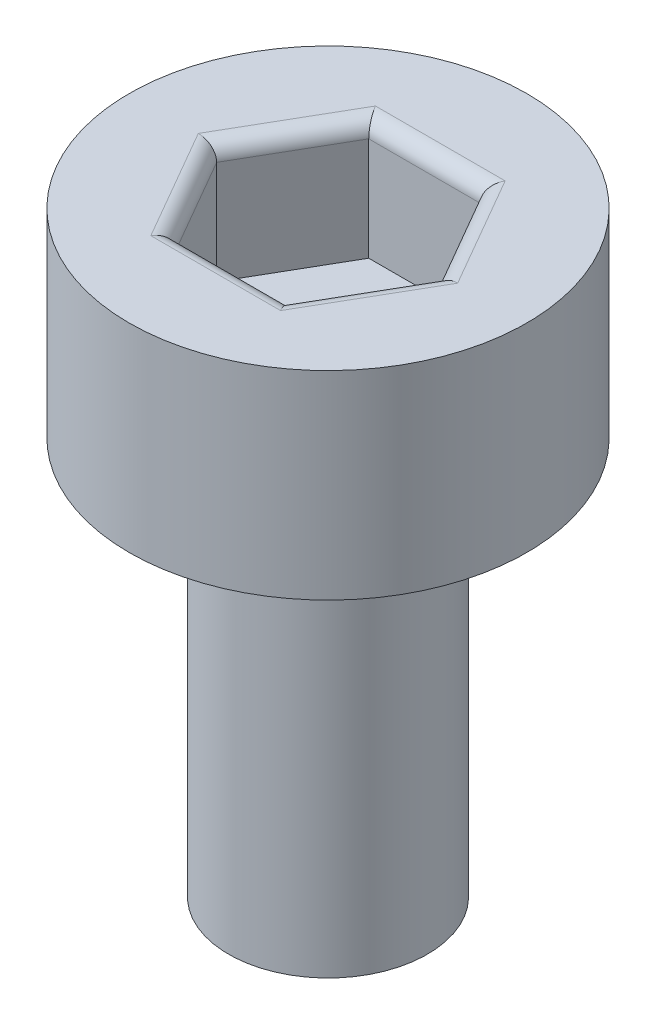
ISO-10303-21;
HEADER;
FILE_DESCRIPTION(('STEP AP214'),'2;1');
FILE_NAME('part.step','',(''),(''),'','','');
FILE_SCHEMA(('AUTOMOTIVE_DESIGN { 1 0 10303 214 1 1 1 1 }'));
ENDSEC;
DATA;
#1=APPLICATION_CONTEXT('core data for automotive mechanical design processes');
#2=APPLICATION_PROTOCOL_DEFINITION('international standard','automotive_design',2000,#1);
#3=PRODUCT_CONTEXT('',#1,'mechanical');
#4=PRODUCT('Part','Part','',(#3));
#5=PRODUCT_RELATED_PRODUCT_CATEGORY('part','',(#4));
#6=PRODUCT_DEFINITION_FORMATION('','',#4);
#7=PRODUCT_DEFINITION_CONTEXT('part definition',#1,'design');
#8=PRODUCT_DEFINITION('design','',#6,#7);
#9=PRODUCT_DEFINITION_SHAPE('','',#8);
#10=(LENGTH_UNIT() NAMED_UNIT(*) SI_UNIT(.MILLI.,.METRE.));
#11=(NAMED_UNIT(*) PLANE_ANGLE_UNIT() SI_UNIT($,.RADIAN.));
#12=(NAMED_UNIT(*) SI_UNIT($,.STERADIAN.) SOLID_ANGLE_UNIT());
#13=UNCERTAINTY_MEASURE_WITH_UNIT(LENGTH_MEASURE(1.E-05),#10,'distance_accuracy_value','');
#14=(GEOMETRIC_REPRESENTATION_CONTEXT(3) GLOBAL_UNCERTAINTY_ASSIGNED_CONTEXT((#13)) GLOBAL_UNIT_ASSIGNED_CONTEXT((#10,
#11,#12)) REPRESENTATION_CONTEXT('',''));
#15=CARTESIAN_POINT('',(0.,0.,0.));
#16=DIRECTION('',(0.,0.,1.));
#17=DIRECTION('',(1.,0.,0.));
#18=AXIS2_PLACEMENT_3D('',#15,#16,#17);
#19=CARTESIAN_POINT('',(0.,2.5,0.));
#20=DIRECTION('',(0.,1.,0.));
#21=DIRECTION('',(0.,0.,1.));
#22=AXIS2_PLACEMENT_3D('',#19,#20,#21);
#23=PLANE('',#22);
#24=DIRECTION('',(0.499999999999998,0.,-0.86602540378444));
#25=VECTOR('',#24,1.);
#26=CARTESIAN_POINT('',(-1.22320508075689,2.5,-0.706217782649105));
#27=LINE('',#26,#25);
#28=CARTESIAN_POINT('',(-1.63094010767585,2.5,0.));
#29=VERTEX_POINT('',#28);
#30=CARTESIAN_POINT('',(-0.81547005383793,2.5,-1.41243556529821));
#31=VERTEX_POINT('',#30);
#32=EDGE_CURVE('E161',#29,#31,#27,.T.);
#33=ORIENTED_EDGE('',*,*,#32,.T.);
#34=DIRECTION('',(1.,0.,0.));
#35=VECTOR('',#34,1.);
#36=CARTESIAN_POINT('',(0.,2.5,-1.41243556529821));
#37=LINE('',#36,#35);
#38=CARTESIAN_POINT('',(0.81547005383792,2.5,-1.41243556529821));
#39=VERTEX_POINT('',#38);
#40=EDGE_CURVE('E163',#31,#39,#37,.T.);
#41=ORIENTED_EDGE('',*,*,#40,.T.);
#42=DIRECTION('',(0.500000000000004,0.,0.866025403784436));
#43=VECTOR('',#42,1.);
#44=CARTESIAN_POINT('',(1.22320508075688,2.5,-0.706217782649112));
#45=LINE('',#44,#43);
#46=CARTESIAN_POINT('',(1.63094010767585,2.5,0.));
#47=VERTEX_POINT('',#46);
#48=EDGE_CURVE('E157',#39,#47,#45,.T.);
#49=ORIENTED_EDGE('',*,*,#48,.T.);
#50=DIRECTION('',(-0.499999999999998,0.,0.86602540378444));
#51=VECTOR('',#50,1.);
#52=CARTESIAN_POINT('',(1.22320508075689,2.5,0.706217782649105));
#53=LINE('',#52,#51);
#54=CARTESIAN_POINT('',(0.815470053837929,2.5,1.41243556529821));
#55=VERTEX_POINT('',#54);
#56=EDGE_CURVE('E153',#47,#55,#53,.T.);
#57=ORIENTED_EDGE('',*,*,#56,.T.);
#58=DIRECTION('',(-1.,0.,0.));
#59=VECTOR('',#58,1.);
#60=CARTESIAN_POINT('',(0.,2.5,1.41243556529821));
#61=LINE('',#60,#59);
#62=CARTESIAN_POINT('',(-0.815470053837919,2.5,1.41243556529821));
#63=VERTEX_POINT('',#62);
#64=EDGE_CURVE('E155',#55,#63,#61,.T.);
#65=ORIENTED_EDGE('',*,*,#64,.T.);
#66=DIRECTION('',(-0.500000000000004,0.,-0.866025403784436));
#67=VECTOR('',#66,1.);
#68=CARTESIAN_POINT('',(-1.22320508075688,2.5,0.706217782649112));
#69=LINE('',#68,#67);
#70=EDGE_CURVE('E159',#63,#29,#69,.T.);
#71=ORIENTED_EDGE('',*,*,#70,.T.);
#72=EDGE_LOOP('',(#33,#41,#49,#57,#65,#71));
#73=FACE_BOUND('',#72,.T.);
#74=CARTESIAN_POINT('',(0.,2.5,0.));
#75=DIRECTION('',(0.,1.,0.));
#76=DIRECTION('',(0.,0.,1.));
#77=AXIS2_PLACEMENT_3D('',#74,#75,#76);
#78=CIRCLE('',#77,2.5);
#79=CARTESIAN_POINT('',(0.,2.5,2.5));
#80=VERTEX_POINT('',#79);
#81=EDGE_CURVE('E144',#80,#80,#78,.T.);
#82=ORIENTED_EDGE('',*,*,#81,.T.);
#83=EDGE_LOOP('',(#82));
#84=FACE_BOUND('',#83,.T.);
#85=ADVANCED_FACE('F43',(#73,#84),#23,.T.);
#86=CARTESIAN_POINT('',(0.,2.5,0.));
#87=DIRECTION('',(0.,-1.,0.));
#88=DIRECTION('',(0.,0.,-1.));
#89=AXIS2_PLACEMENT_3D('',#86,#87,#88);
#90=CYLINDRICAL_SURFACE('',#89,2.5);
#91=ORIENTED_EDGE('',*,*,#81,.F.);
#92=EDGE_LOOP('',(#91));
#93=FACE_BOUND('',#92,.T.);
#94=CARTESIAN_POINT('',(0.,0.,0.));
#95=DIRECTION('',(0.,1.,0.));
#96=DIRECTION('',(0.,0.,1.));
#97=AXIS2_PLACEMENT_3D('',#94,#95,#96);
#98=CIRCLE('',#97,2.5);
#99=CARTESIAN_POINT('',(0.,0.,2.5));
#100=VERTEX_POINT('',#99);
#101=EDGE_CURVE('E140',#100,#100,#98,.T.);
#102=ORIENTED_EDGE('',*,*,#101,.T.);
#103=EDGE_LOOP('',(#102));
#104=FACE_BOUND('',#103,.T.);
#105=ADVANCED_FACE('F246',(#93,#104),#90,.T.);
#106=CARTESIAN_POINT('',(0.,0.,0.));
#107=DIRECTION('',(0.,1.,0.));
#108=DIRECTION('',(0.,0.,1.));
#109=AXIS2_PLACEMENT_3D('',#106,#107,#108);
#110=PLANE('',#109);
#111=CARTESIAN_POINT('',(0.,0.,0.));
#112=DIRECTION('',(0.,-1.,0.));
#113=DIRECTION('',(0.,0.,-1.));
#114=AXIS2_PLACEMENT_3D('',#111,#112,#113);
#115=CIRCLE('',#114,1.25);
#116=CARTESIAN_POINT('',(0.,0.,-1.25));
#117=VERTEX_POINT('',#116);
#118=EDGE_CURVE('E151',#117,#117,#115,.T.);
#119=ORIENTED_EDGE('',*,*,#118,.F.);
#120=EDGE_LOOP('',(#119));
#121=FACE_BOUND('',#120,.T.);
#122=ORIENTED_EDGE('',*,*,#101,.F.);
#123=EDGE_LOOP('',(#122));
#124=FACE_BOUND('',#123,.T.);
#125=ADVANCED_FACE('F251',(#121,#124),#110,.F.);
#126=CARTESIAN_POINT('',(-0.699999999999995,1.,1.21243556529821));
#127=DIRECTION('',(0.866025403784436,0.,-0.500000000000004));
#128=DIRECTION('',(-0.500000000000004,0.,-0.866025403784436));
#129=AXIS2_PLACEMENT_3D('',#126,#127,#128);
#130=PLANE('',#129);
#131=DIRECTION('',(0.,1.,0.));
#132=VECTOR('',#131,1.);
#133=CARTESIAN_POINT('',(-1.4,1.,0.));
#134=LINE('',#133,#132);
#135=CARTESIAN_POINT('',(-1.4,1.,0.));
#136=VERTEX_POINT('',#135);
#137=CARTESIAN_POINT('',(-1.4,2.3,0.));
#138=VERTEX_POINT('',#137);
#139=EDGE_CURVE('E132',#136,#138,#134,.T.);
#140=ORIENTED_EDGE('',*,*,#139,.T.);
#141=DIRECTION('',(-0.500000000000004,0.,-0.866025403784436));
#142=VECTOR('',#141,1.);
#143=CARTESIAN_POINT('',(-0.699999999999995,2.3,1.21243556529821));
#144=LINE('',#143,#142);
#145=CARTESIAN_POINT('',(-0.699999999999995,2.3,1.21243556529821));
#146=VERTEX_POINT('',#145);
#147=EDGE_CURVE('E170',#138,#146,#144,.F.);
#148=ORIENTED_EDGE('',*,*,#147,.T.);
#149=DIRECTION('',(0.,1.,0.));
#150=VECTOR('',#149,1.);
#151=CARTESIAN_POINT('',(-0.699999999999995,1.,1.21243556529821));
#152=LINE('',#151,#150);
#153=CARTESIAN_POINT('',(-0.699999999999995,1.,1.21243556529821));
#154=VERTEX_POINT('',#153);
#155=EDGE_CURVE('E134',#154,#146,#152,.T.);
#156=ORIENTED_EDGE('',*,*,#155,.F.);
#157=DIRECTION('',(-0.500000000000004,0.,-0.866025403784436));
#158=VECTOR('',#157,1.);
#159=CARTESIAN_POINT('',(-0.699999999999995,1.,1.21243556529821));
#160=LINE('',#159,#158);
#161=EDGE_CURVE('E120',#154,#136,#160,.T.);
#162=ORIENTED_EDGE('',*,*,#161,.T.);
#163=EDGE_LOOP('',(#140,#148,#156,#162));
#164=FACE_BOUND('',#163,.T.);
#165=ADVANCED_FACE('F131',(#164),#130,.T.);
#166=CARTESIAN_POINT('',(-1.4,1.,0.));
#167=DIRECTION('',(0.86602540378444,0.,0.499999999999998));
#168=DIRECTION('',(0.499999999999998,0.,-0.86602540378444));
#169=AXIS2_PLACEMENT_3D('',#166,#167,#168);
#170=PLANE('',#169);
#171=DIRECTION('',(0.,1.,0.));
#172=VECTOR('',#171,1.);
#173=CARTESIAN_POINT('',(-0.700000000000004,1.,-1.21243556529821));
#174=LINE('',#173,#172);
#175=CARTESIAN_POINT('',(-0.700000000000004,1.,-1.21243556529821));
#176=VERTEX_POINT('',#175);
#177=CARTESIAN_POINT('',(-0.700000000000004,2.3,-1.21243556529821));
#178=VERTEX_POINT('',#177);
#179=EDGE_CURVE('E141',#176,#178,#174,.T.);
#180=ORIENTED_EDGE('',*,*,#179,.T.);
#181=DIRECTION('',(0.499999999999998,0.,-0.86602540378444));
#182=VECTOR('',#181,1.);
#183=CARTESIAN_POINT('',(-1.4,2.3,0.));
#184=LINE('',#183,#182);
#185=EDGE_CURVE('E139',#178,#138,#184,.F.);
#186=ORIENTED_EDGE('',*,*,#185,.T.);
#187=ORIENTED_EDGE('',*,*,#139,.F.);
#188=DIRECTION('',(0.499999999999998,0.,-0.86602540378444));
#189=VECTOR('',#188,1.);
#190=CARTESIAN_POINT('',(-1.4,1.,0.));
#191=LINE('',#190,#189);
#192=EDGE_CURVE('E116',#136,#176,#191,.T.);
#193=ORIENTED_EDGE('',*,*,#192,.T.);
#194=EDGE_LOOP('',(#180,#186,#187,#193));
#195=FACE_BOUND('',#194,.T.);
#196=ADVANCED_FACE('F137',(#195),#170,.T.);
#197=CARTESIAN_POINT('',(-0.700000000000004,1.,-1.21243556529821));
#198=DIRECTION('',(0.,0.,1.));
#199=DIRECTION('',(1.,0.,0.));
#200=AXIS2_PLACEMENT_3D('',#197,#198,#199);
#201=PLANE('',#200);
#202=DIRECTION('',(0.,1.,0.));
#203=VECTOR('',#202,1.);
#204=CARTESIAN_POINT('',(0.699999999999995,1.,-1.21243556529821));
#205=LINE('',#204,#203);
#206=CARTESIAN_POINT('',(0.699999999999995,1.,-1.21243556529821));
#207=VERTEX_POINT('',#206);
#208=CARTESIAN_POINT('',(0.699999999999995,2.3,-1.21243556529821));
#209=VERTEX_POINT('',#208);
#210=EDGE_CURVE('E146',#207,#209,#205,.T.);
#211=ORIENTED_EDGE('',*,*,#210,.T.);
#212=DIRECTION('',(1.,0.,0.));
#213=VECTOR('',#212,1.);
#214=CARTESIAN_POINT('',(-0.700000000000004,2.3,-1.21243556529821));
#215=LINE('',#214,#213);
#216=EDGE_CURVE('E166',#209,#178,#215,.F.);
#217=ORIENTED_EDGE('',*,*,#216,.T.);
#218=ORIENTED_EDGE('',*,*,#179,.F.);
#219=DIRECTION('',(1.,0.,0.));
#220=VECTOR('',#219,1.);
#221=CARTESIAN_POINT('',(-0.700000000000004,1.,-1.21243556529821));
#222=LINE('',#221,#220);
#223=EDGE_CURVE('E122',#176,#207,#222,.T.);
#224=ORIENTED_EDGE('',*,*,#223,.T.);
#225=EDGE_LOOP('',(#211,#217,#218,#224));
#226=FACE_BOUND('',#225,.T.);
#227=ADVANCED_FACE('F215',(#226),#201,.T.);
#228=CARTESIAN_POINT('',(0.699999999999995,1.,-1.21243556529821));
#229=DIRECTION('',(-0.866025403784436,0.,0.500000000000004));
#230=DIRECTION('',(0.500000000000004,0.,0.866025403784436));
#231=AXIS2_PLACEMENT_3D('',#228,#229,#230);
#232=PLANE('',#231);
#233=DIRECTION('',(0.,1.,0.));
#234=VECTOR('',#233,1.);
#235=CARTESIAN_POINT('',(1.4,1.,0.));
#236=LINE('',#235,#234);
#237=CARTESIAN_POINT('',(1.4,1.,0.));
#238=VERTEX_POINT('',#237);
#239=CARTESIAN_POINT('',(1.4,2.3,0.));
#240=VERTEX_POINT('',#239);
#241=EDGE_CURVE('E210',#238,#240,#236,.T.);
#242=ORIENTED_EDGE('',*,*,#241,.T.);
#243=DIRECTION('',(0.500000000000004,0.,0.866025403784436));
#244=VECTOR('',#243,1.);
#245=CARTESIAN_POINT('',(0.699999999999995,2.3,-1.21243556529821));
#246=LINE('',#245,#244);
#247=EDGE_CURVE('E172',#240,#209,#246,.F.);
#248=ORIENTED_EDGE('',*,*,#247,.T.);
#249=ORIENTED_EDGE('',*,*,#210,.F.);
#250=DIRECTION('',(0.500000000000004,0.,0.866025403784436));
#251=VECTOR('',#250,1.);
#252=CARTESIAN_POINT('',(0.699999999999995,1.,-1.21243556529821));
#253=LINE('',#252,#251);
#254=EDGE_CURVE('E201',#207,#238,#253,.T.);
#255=ORIENTED_EDGE('',*,*,#254,.T.);
#256=EDGE_LOOP('',(#242,#248,#249,#255));
#257=FACE_BOUND('',#256,.T.);
#258=ADVANCED_FACE('F357',(#257),#232,.T.);
#259=CARTESIAN_POINT('',(1.4,1.,0.));
#260=DIRECTION('',(-0.86602540378444,0.,-0.499999999999998));
#261=DIRECTION('',(-0.499999999999998,0.,0.86602540378444));
#262=AXIS2_PLACEMENT_3D('',#259,#260,#261);
#263=PLANE('',#262);
#264=DIRECTION('',(0.,1.,0.));
#265=VECTOR('',#264,1.);
#266=CARTESIAN_POINT('',(0.700000000000004,1.,1.21243556529821));
#267=LINE('',#266,#265);
#268=CARTESIAN_POINT('',(0.700000000000004,1.,1.21243556529821));
#269=VERTEX_POINT('',#268);
#270=CARTESIAN_POINT('',(0.700000000000004,2.3,1.21243556529821));
#271=VERTEX_POINT('',#270);
#272=EDGE_CURVE('E208',#269,#271,#267,.T.);
#273=ORIENTED_EDGE('',*,*,#272,.T.);
#274=DIRECTION('',(-0.499999999999998,0.,0.86602540378444));
#275=VECTOR('',#274,1.);
#276=CARTESIAN_POINT('',(1.4,2.3,0.));
#277=LINE('',#276,#275);
#278=EDGE_CURVE('E11',#271,#240,#277,.F.);
#279=ORIENTED_EDGE('',*,*,#278,.T.);
#280=ORIENTED_EDGE('',*,*,#241,.F.);
#281=DIRECTION('',(-0.499999999999998,0.,0.86602540378444));
#282=VECTOR('',#281,1.);
#283=CARTESIAN_POINT('',(1.4,1.,0.));
#284=LINE('',#283,#282);
#285=EDGE_CURVE('E203',#238,#269,#284,.T.);
#286=ORIENTED_EDGE('',*,*,#285,.T.);
#287=EDGE_LOOP('',(#273,#279,#280,#286));
#288=FACE_BOUND('',#287,.T.);
#289=ADVANCED_FACE('F347',(#288),#263,.T.);
#290=CARTESIAN_POINT('',(0.700000000000004,1.,1.21243556529821));
#291=DIRECTION('',(0.,0.,-1.));
#292=DIRECTION('',(-1.,0.,0.));
#293=AXIS2_PLACEMENT_3D('',#290,#291,#292);
#294=PLANE('',#293);
#295=ORIENTED_EDGE('',*,*,#155,.T.);
#296=DIRECTION('',(-1.,0.,0.));
#297=VECTOR('',#296,1.);
#298=CARTESIAN_POINT('',(0.700000000000004,2.3,1.21243556529821));
#299=LINE('',#298,#297);
#300=EDGE_CURVE('E52',#146,#271,#299,.F.);
#301=ORIENTED_EDGE('',*,*,#300,.T.);
#302=ORIENTED_EDGE('',*,*,#272,.F.);
#303=DIRECTION('',(-1.,0.,0.));
#304=VECTOR('',#303,1.);
#305=CARTESIAN_POINT('',(0.700000000000004,1.,1.21243556529821));
#306=LINE('',#305,#304);
#307=EDGE_CURVE('E205',#269,#154,#306,.T.);
#308=ORIENTED_EDGE('',*,*,#307,.T.);
#309=EDGE_LOOP('',(#295,#301,#302,#308));
#310=FACE_BOUND('',#309,.T.);
#311=ADVANCED_FACE('F234',(#310),#294,.T.);
#312=CARTESIAN_POINT('',(0.,1.,0.));
#313=DIRECTION('',(0.,-1.,0.));
#314=DIRECTION('',(0.,0.,-1.));
#315=AXIS2_PLACEMENT_3D('',#312,#313,#314);
#316=PLANE('',#315);
#317=ORIENTED_EDGE('',*,*,#161,.F.);
#318=ORIENTED_EDGE('',*,*,#307,.F.);
#319=ORIENTED_EDGE('',*,*,#285,.F.);
#320=ORIENTED_EDGE('',*,*,#254,.F.);
#321=ORIENTED_EDGE('',*,*,#223,.F.);
#322=ORIENTED_EDGE('',*,*,#192,.F.);
#323=EDGE_LOOP('',(#317,#318,#319,#320,#321,#322));
#324=FACE_BOUND('',#323,.T.);
#325=ADVANCED_FACE('F118',(#324),#316,.F.);
#326=CARTESIAN_POINT('',(0.,-5.,0.));
#327=DIRECTION('',(0.,1.,0.));
#328=DIRECTION('',(0.,0.,1.));
#329=AXIS2_PLACEMENT_3D('',#326,#327,#328);
#330=CYLINDRICAL_SURFACE('',#329,1.25);
#331=CARTESIAN_POINT('',(0.,-5.,0.));
#332=DIRECTION('',(0.,-1.,0.));
#333=DIRECTION('',(0.,0.,-1.));
#334=AXIS2_PLACEMENT_3D('',#331,#332,#333);
#335=CIRCLE('',#334,1.25);
#336=CARTESIAN_POINT('',(0.,-5.,-1.25));
#337=VERTEX_POINT('',#336);
#338=EDGE_CURVE('E135',#337,#337,#335,.T.);
#339=ORIENTED_EDGE('',*,*,#338,.F.);
#340=EDGE_LOOP('',(#339));
#341=FACE_BOUND('',#340,.T.);
#342=ORIENTED_EDGE('',*,*,#118,.T.);
#343=EDGE_LOOP('',(#342));
#344=FACE_BOUND('',#343,.T.);
#345=ADVANCED_FACE('F317',(#341,#344),#330,.T.);
#346=CARTESIAN_POINT('',(0.,-5.,0.));
#347=DIRECTION('',(0.,-1.,0.));
#348=DIRECTION('',(0.,0.,-1.));
#349=AXIS2_PLACEMENT_3D('',#346,#347,#348);
#350=PLANE('',#349);
#351=ORIENTED_EDGE('',*,*,#338,.T.);
#352=EDGE_LOOP('',(#351));
#353=FACE_BOUND('',#352,.T.);
#354=ADVANCED_FACE('F307',(#353),#350,.T.);
#355=CARTESIAN_POINT('',(0.,2.3,1.41243556529821));
#356=DIRECTION('',(-1.,0.,0.));
#357=DIRECTION('',(0.,0.,1.));
#358=AXIS2_PLACEMENT_3D('',#355,#356,#357);
#359=CYLINDRICAL_SURFACE('',#358,0.2);
#360=CARTESIAN_POINT('',(0.815470053837929,2.3,1.41243556529821));
#361=DIRECTION('',(-0.866025403784438,0.,0.500000000000001));
#362=DIRECTION('',(-0.500000000000001,0.,-0.866025403784438));
#363=AXIS2_PLACEMENT_3D('',#360,#361,#362);
#364=ELLIPSE('',#363,0.23094010767585,0.2);
#365=EDGE_CURVE('E184',#271,#55,#364,.F.);
#366=ORIENTED_EDGE('',*,*,#365,.F.);
#367=ORIENTED_EDGE('',*,*,#300,.F.);
#368=CARTESIAN_POINT('',(-0.81547005383792,2.3,1.41243556529821));
#369=DIRECTION('',(-0.86602540378444,0.,-0.499999999999998));
#370=DIRECTION('',(0.499999999999998,0.,-0.86602540378444));
#371=AXIS2_PLACEMENT_3D('',#368,#369,#370);
#372=ELLIPSE('',#371,0.23094010767585,0.2);
#373=EDGE_CURVE('E47',#63,#146,#372,.T.);
#374=ORIENTED_EDGE('',*,*,#373,.F.);
#375=ORIENTED_EDGE('',*,*,#64,.F.);
#376=EDGE_LOOP('',(#366,#367,#374,#375));
#377=FACE_BOUND('',#376,.T.);
#378=ADVANCED_FACE('F45',(#377),#359,.T.);
#379=CARTESIAN_POINT('',(-1.22320508075688,2.3,0.706217782649112));
#380=DIRECTION('',(-0.500000000000004,0.,-0.866025403784436));
#381=DIRECTION('',(-0.866025403784436,0.,0.500000000000004));
#382=AXIS2_PLACEMENT_3D('',#379,#380,#381);
#383=CYLINDRICAL_SURFACE('',#382,0.2);
#384=ORIENTED_EDGE('',*,*,#373,.T.);
#385=ORIENTED_EDGE('',*,*,#147,.F.);
#386=CARTESIAN_POINT('',(-1.63094010767585,2.3,0.));
#387=DIRECTION('',(0.,0.,-1.));
#388=DIRECTION('',(1.,0.,0.));
#389=AXIS2_PLACEMENT_3D('',#386,#387,#388);
#390=ELLIPSE('',#389,0.23094010767585,0.2);
#391=EDGE_CURVE('E182',#29,#138,#390,.T.);
#392=ORIENTED_EDGE('',*,*,#391,.F.);
#393=ORIENTED_EDGE('',*,*,#70,.F.);
#394=EDGE_LOOP('',(#384,#385,#392,#393));
#395=FACE_BOUND('',#394,.T.);
#396=ADVANCED_FACE('F233',(#395),#383,.T.);
#397=CARTESIAN_POINT('',(1.22320508075689,2.3,0.706217782649105));
#398=DIRECTION('',(-0.499999999999998,0.,0.86602540378444));
#399=DIRECTION('',(0.86602540378444,0.,0.499999999999998));
#400=AXIS2_PLACEMENT_3D('',#397,#398,#399);
#401=CYLINDRICAL_SURFACE('',#400,0.2);
#402=ORIENTED_EDGE('',*,*,#365,.T.);
#403=ORIENTED_EDGE('',*,*,#56,.F.);
#404=CARTESIAN_POINT('',(1.63094010767585,2.3,0.));
#405=DIRECTION('',(0.,0.,1.));
#406=DIRECTION('',(1.,0.,0.));
#407=AXIS2_PLACEMENT_3D('',#404,#405,#406);
#408=ELLIPSE('',#407,0.23094010767585,0.2);
#409=EDGE_CURVE('E179',#240,#47,#408,.F.);
#410=ORIENTED_EDGE('',*,*,#409,.F.);
#411=ORIENTED_EDGE('',*,*,#278,.F.);
#412=EDGE_LOOP('',(#402,#403,#410,#411));
#413=FACE_BOUND('',#412,.T.);
#414=ADVANCED_FACE('F237',(#413),#401,.T.);
#415=CARTESIAN_POINT('',(-1.22320508075689,2.3,-0.706217782649105));
#416=DIRECTION('',(0.499999999999998,0.,-0.86602540378444));
#417=DIRECTION('',(-0.86602540378444,0.,-0.499999999999998));
#418=AXIS2_PLACEMENT_3D('',#415,#416,#417);
#419=CYLINDRICAL_SURFACE('',#418,0.2);
#420=ORIENTED_EDGE('',*,*,#391,.T.);
#421=ORIENTED_EDGE('',*,*,#185,.F.);
#422=CARTESIAN_POINT('',(-0.81547005383793,2.3,-1.41243556529821));
#423=DIRECTION('',(0.866025403784438,0.,-0.500000000000001));
#424=DIRECTION('',(0.500000000000001,0.,0.866025403784438));
#425=AXIS2_PLACEMENT_3D('',#422,#423,#424);
#426=ELLIPSE('',#425,0.23094010767585,0.2);
#427=EDGE_CURVE('E177',#31,#178,#426,.T.);
#428=ORIENTED_EDGE('',*,*,#427,.F.);
#429=ORIENTED_EDGE('',*,*,#32,.F.);
#430=EDGE_LOOP('',(#420,#421,#428,#429));
#431=FACE_BOUND('',#430,.T.);
#432=ADVANCED_FACE('F232',(#431),#419,.T.);
#433=CARTESIAN_POINT('',(1.22320508075688,2.3,-0.706217782649112));
#434=DIRECTION('',(0.500000000000004,0.,0.866025403784436));
#435=DIRECTION('',(0.866025403784436,0.,-0.500000000000004));
#436=AXIS2_PLACEMENT_3D('',#433,#434,#435);
#437=CYLINDRICAL_SURFACE('',#436,0.2);
#438=ORIENTED_EDGE('',*,*,#409,.T.);
#439=ORIENTED_EDGE('',*,*,#48,.F.);
#440=CARTESIAN_POINT('',(0.815470053837919,2.3,-1.41243556529821));
#441=DIRECTION('',(0.86602540378444,0.,0.499999999999998));
#442=DIRECTION('',(0.499999999999998,0.,-0.86602540378444));
#443=AXIS2_PLACEMENT_3D('',#440,#441,#442);
#444=ELLIPSE('',#443,0.23094010767585,0.2);
#445=EDGE_CURVE('E175',#209,#39,#444,.F.);
#446=ORIENTED_EDGE('',*,*,#445,.F.);
#447=ORIENTED_EDGE('',*,*,#247,.F.);
#448=EDGE_LOOP('',(#438,#439,#446,#447));
#449=FACE_BOUND('',#448,.T.);
#450=ADVANCED_FACE('F225',(#449),#437,.T.);
#451=CARTESIAN_POINT('',(0.,2.3,-1.41243556529821));
#452=DIRECTION('',(1.,0.,0.));
#453=DIRECTION('',(0.,0.,-1.));
#454=AXIS2_PLACEMENT_3D('',#451,#452,#453);
#455=CYLINDRICAL_SURFACE('',#454,0.2);
#456=ORIENTED_EDGE('',*,*,#427,.T.);
#457=ORIENTED_EDGE('',*,*,#216,.F.);
#458=ORIENTED_EDGE('',*,*,#445,.T.);
#459=ORIENTED_EDGE('',*,*,#40,.F.);
#460=EDGE_LOOP('',(#456,#457,#458,#459));
#461=FACE_BOUND('',#460,.T.);
#462=ADVANCED_FACE('F219',(#461),#455,.T.);
#463=CLOSED_SHELL('',(#85,#105,#125,#165,#196,#227,#258,#289,#311,#325,#345,#354,#378,#396,#414,
#432,#450,#462));
#464=MANIFOLD_SOLID_BREP('B2',#463);
#465=ADVANCED_BREP_SHAPE_REPRESENTATION('',(#18,#464),#14);
#466=SHAPE_DEFINITION_REPRESENTATION(#9,#465);
ENDSEC;
END-ISO-10303-21;
